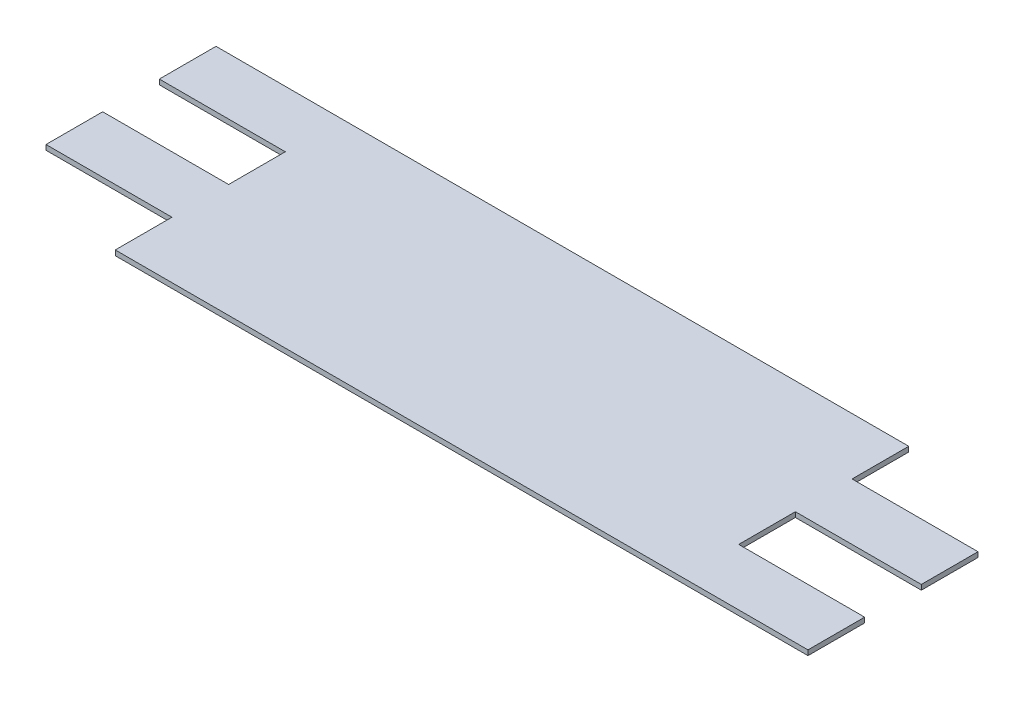
ISO-10303-21;
HEADER;
FILE_DESCRIPTION(('STEP AP214'),'2;1');
FILE_NAME('part.step','',(''),(''),'','','');
FILE_SCHEMA(('AUTOMOTIVE_DESIGN { 1 0 10303 214 1 1 1 1 }'));
ENDSEC;
DATA;
#1=APPLICATION_CONTEXT('core data for automotive mechanical design processes');
#2=APPLICATION_PROTOCOL_DEFINITION('international standard','automotive_design',2000,#1);
#3=PRODUCT_CONTEXT('',#1,'mechanical');
#4=PRODUCT('Part','Part','',(#3));
#5=PRODUCT_RELATED_PRODUCT_CATEGORY('part','',(#4));
#6=PRODUCT_DEFINITION_FORMATION('','',#4);
#7=PRODUCT_DEFINITION_CONTEXT('part definition',#1,'design');
#8=PRODUCT_DEFINITION('design','',#6,#7);
#9=PRODUCT_DEFINITION_SHAPE('','',#8);
#10=(LENGTH_UNIT() NAMED_UNIT(*) SI_UNIT(.MILLI.,.METRE.));
#11=(NAMED_UNIT(*) PLANE_ANGLE_UNIT() SI_UNIT($,.RADIAN.));
#12=(NAMED_UNIT(*) SI_UNIT($,.STERADIAN.) SOLID_ANGLE_UNIT());
#13=UNCERTAINTY_MEASURE_WITH_UNIT(LENGTH_MEASURE(1.E-05),#10,'distance_accuracy_value','');
#14=(GEOMETRIC_REPRESENTATION_CONTEXT(3) GLOBAL_UNCERTAINTY_ASSIGNED_CONTEXT((#13)) GLOBAL_UNIT_ASSIGNED_CONTEXT((#10,
#11,#12)) REPRESENTATION_CONTEXT('',''));
#15=CARTESIAN_POINT('',(0.,0.,0.));
#16=DIRECTION('',(0.,0.,1.));
#17=DIRECTION('',(1.,0.,0.));
#18=AXIS2_PLACEMENT_3D('',#15,#16,#17);
#19=CARTESIAN_POINT('',(0.,0.4,0.));
#20=DIRECTION('',(1.,0.,0.));
#21=DIRECTION('',(0.,0.,-1.));
#22=AXIS2_PLACEMENT_3D('',#19,#20,#21);
#23=PLANE('',#22);
#24=DIRECTION('',(0.,0.,1.));
#25=VECTOR('',#24,1.);
#26=CARTESIAN_POINT('',(0.,0.,0.));
#27=LINE('',#26,#25);
#28=CARTESIAN_POINT('',(0.,0.,0.));
#29=VERTEX_POINT('',#28);
#30=CARTESIAN_POINT('',(0.,0.,4.5));
#31=VERTEX_POINT('',#30);
#32=EDGE_CURVE('E183',#29,#31,#27,.T.);
#33=ORIENTED_EDGE('',*,*,#32,.T.);
#34=DIRECTION('',(0.,-1.,0.));
#35=VECTOR('',#34,1.);
#36=CARTESIAN_POINT('',(0.,0.4,4.5));
#37=LINE('',#36,#35);
#38=CARTESIAN_POINT('',(0.,0.4,4.5));
#39=VERTEX_POINT('',#38);
#40=EDGE_CURVE('E11',#39,#31,#37,.T.);
#41=ORIENTED_EDGE('',*,*,#40,.F.);
#42=DIRECTION('',(0.,0.,1.));
#43=VECTOR('',#42,1.);
#44=CARTESIAN_POINT('',(0.,0.4,0.));
#45=LINE('',#44,#43);
#46=CARTESIAN_POINT('',(0.,0.4,0.));
#47=VERTEX_POINT('',#46);
#48=EDGE_CURVE('E213',#47,#39,#45,.T.);
#49=ORIENTED_EDGE('',*,*,#48,.F.);
#50=DIRECTION('',(0.,-1.,0.));
#51=VECTOR('',#50,1.);
#52=CARTESIAN_POINT('',(0.,0.4,0.));
#53=LINE('',#52,#51);
#54=EDGE_CURVE('E179',#47,#29,#53,.T.);
#55=ORIENTED_EDGE('',*,*,#54,.T.);
#56=EDGE_LOOP('',(#33,#41,#49,#55));
#57=FACE_BOUND('',#56,.T.);
#58=ADVANCED_FACE('F39',(#57),#23,.F.);
#59=CARTESIAN_POINT('',(0.,0.4,4.5));
#60=DIRECTION('',(0.,0.,-1.));
#61=DIRECTION('',(-1.,0.,0.));
#62=AXIS2_PLACEMENT_3D('',#59,#60,#61);
#63=PLANE('',#62);
#64=DIRECTION('',(1.,0.,0.));
#65=VECTOR('',#64,1.);
#66=CARTESIAN_POINT('',(0.,0.,4.5));
#67=LINE('',#66,#65);
#68=CARTESIAN_POINT('',(10.,0.,4.5));
#69=VERTEX_POINT('',#68);
#70=EDGE_CURVE('E186',#31,#69,#67,.T.);
#71=ORIENTED_EDGE('',*,*,#70,.T.);
#72=DIRECTION('',(0.,-1.,0.));
#73=VECTOR('',#72,1.);
#74=CARTESIAN_POINT('',(10.,0.4,4.5));
#75=LINE('',#74,#73);
#76=CARTESIAN_POINT('',(10.,0.4,4.5));
#77=VERTEX_POINT('',#76);
#78=EDGE_CURVE('E47',#77,#69,#75,.T.);
#79=ORIENTED_EDGE('',*,*,#78,.F.);
#80=DIRECTION('',(1.,0.,0.));
#81=VECTOR('',#80,1.);
#82=CARTESIAN_POINT('',(0.,0.4,4.5));
#83=LINE('',#82,#81);
#84=EDGE_CURVE('E122',#39,#77,#83,.T.);
#85=ORIENTED_EDGE('',*,*,#84,.F.);
#86=ORIENTED_EDGE('',*,*,#40,.T.);
#87=EDGE_LOOP('',(#71,#79,#85,#86));
#88=FACE_BOUND('',#87,.T.);
#89=ADVANCED_FACE('F311',(#88),#63,.F.);
#90=CARTESIAN_POINT('',(10.,0.4,4.5));
#91=DIRECTION('',(1.,0.,0.));
#92=DIRECTION('',(0.,0.,-1.));
#93=AXIS2_PLACEMENT_3D('',#90,#91,#92);
#94=PLANE('',#93);
#95=DIRECTION('',(0.,0.,1.));
#96=VECTOR('',#95,1.);
#97=CARTESIAN_POINT('',(10.,0.,4.5));
#98=LINE('',#97,#96);
#99=CARTESIAN_POINT('',(10.,0.,9.));
#100=VERTEX_POINT('',#99);
#101=EDGE_CURVE('E188',#69,#100,#98,.T.);
#102=ORIENTED_EDGE('',*,*,#101,.T.);
#103=DIRECTION('',(0.,-1.,0.));
#104=VECTOR('',#103,1.);
#105=CARTESIAN_POINT('',(10.,0.4,9.));
#106=LINE('',#105,#104);
#107=CARTESIAN_POINT('',(10.,0.4,9.));
#108=VERTEX_POINT('',#107);
#109=EDGE_CURVE('E244',#108,#100,#106,.T.);
#110=ORIENTED_EDGE('',*,*,#109,.F.);
#111=DIRECTION('',(0.,0.,1.));
#112=VECTOR('',#111,1.);
#113=CARTESIAN_POINT('',(10.,0.4,4.5));
#114=LINE('',#113,#112);
#115=EDGE_CURVE('E252',#77,#108,#114,.T.);
#116=ORIENTED_EDGE('',*,*,#115,.F.);
#117=ORIENTED_EDGE('',*,*,#78,.T.);
#118=EDGE_LOOP('',(#102,#110,#116,#117));
#119=FACE_BOUND('',#118,.T.);
#120=ADVANCED_FACE('F250',(#119),#94,.F.);
#121=CARTESIAN_POINT('',(10.,0.4,9.));
#122=DIRECTION('',(0.,0.,1.));
#123=DIRECTION('',(1.,0.,0.));
#124=AXIS2_PLACEMENT_3D('',#121,#122,#123);
#125=PLANE('',#124);
#126=DIRECTION('',(-1.,0.,0.));
#127=VECTOR('',#126,1.);
#128=CARTESIAN_POINT('',(10.,0.,9.));
#129=LINE('',#128,#127);
#130=CARTESIAN_POINT('',(0.,0.,8.99999999999988));
#131=VERTEX_POINT('',#130);
#132=EDGE_CURVE('E190',#100,#131,#129,.T.);
#133=ORIENTED_EDGE('',*,*,#132,.T.);
#134=DIRECTION('',(0.,-1.,0.));
#135=VECTOR('',#134,1.);
#136=CARTESIAN_POINT('',(0.,0.4,8.99999999999988));
#137=LINE('',#136,#135);
#138=CARTESIAN_POINT('',(0.,0.4,8.99999999999988));
#139=VERTEX_POINT('',#138);
#140=EDGE_CURVE('E241',#139,#131,#137,.T.);
#141=ORIENTED_EDGE('',*,*,#140,.F.);
#142=DIRECTION('',(-1.,0.,0.));
#143=VECTOR('',#142,1.);
#144=CARTESIAN_POINT('',(10.,0.4,9.));
#145=LINE('',#144,#143);
#146=EDGE_CURVE('E270',#108,#139,#145,.T.);
#147=ORIENTED_EDGE('',*,*,#146,.F.);
#148=ORIENTED_EDGE('',*,*,#109,.T.);
#149=EDGE_LOOP('',(#133,#141,#147,#148));
#150=FACE_BOUND('',#149,.T.);
#151=ADVANCED_FACE('F261',(#150),#125,.F.);
#152=CARTESIAN_POINT('',(0.,0.4,8.99999999999988));
#153=DIRECTION('',(1.,0.,0.));
#154=DIRECTION('',(0.,0.,-1.));
#155=AXIS2_PLACEMENT_3D('',#152,#153,#154);
#156=PLANE('',#155);
#157=DIRECTION('',(0.,0.,1.));
#158=VECTOR('',#157,1.);
#159=CARTESIAN_POINT('',(0.,0.,8.99999999999988));
#160=LINE('',#159,#158);
#161=CARTESIAN_POINT('',(0.,0.,13.5000000000007));
#162=VERTEX_POINT('',#161);
#163=EDGE_CURVE('E192',#131,#162,#160,.T.);
#164=ORIENTED_EDGE('',*,*,#163,.T.);
#165=DIRECTION('',(0.,-1.,0.));
#166=VECTOR('',#165,1.);
#167=CARTESIAN_POINT('',(0.,0.4,13.5000000000007));
#168=LINE('',#167,#166);
#169=CARTESIAN_POINT('',(0.,0.4,13.5000000000007));
#170=VERTEX_POINT('',#169);
#171=EDGE_CURVE('E238',#170,#162,#168,.T.);
#172=ORIENTED_EDGE('',*,*,#171,.F.);
#173=DIRECTION('',(0.,0.,1.));
#174=VECTOR('',#173,1.);
#175=CARTESIAN_POINT('',(0.,0.4,8.99999999999988));
#176=LINE('',#175,#174);
#177=EDGE_CURVE('E267',#139,#170,#176,.T.);
#178=ORIENTED_EDGE('',*,*,#177,.F.);
#179=ORIENTED_EDGE('',*,*,#140,.T.);
#180=EDGE_LOOP('',(#164,#172,#178,#179));
#181=FACE_BOUND('',#180,.T.);
#182=ADVANCED_FACE('F265',(#181),#156,.F.);
#183=CARTESIAN_POINT('',(0.,0.4,13.5000000000007));
#184=DIRECTION('',(0.,0.,-1.));
#185=DIRECTION('',(-1.,0.,0.));
#186=AXIS2_PLACEMENT_3D('',#183,#184,#185);
#187=PLANE('',#186);
#188=DIRECTION('',(1.,0.,0.));
#189=VECTOR('',#188,1.);
#190=CARTESIAN_POINT('',(0.,0.,13.5000000000007));
#191=LINE('',#190,#189);
#192=CARTESIAN_POINT('',(10.,0.,13.5));
#193=VERTEX_POINT('',#192);
#194=EDGE_CURVE('E194',#162,#193,#191,.T.);
#195=ORIENTED_EDGE('',*,*,#194,.T.);
#196=DIRECTION('',(0.,-1.,0.));
#197=VECTOR('',#196,1.);
#198=CARTESIAN_POINT('',(10.,0.4,13.5));
#199=LINE('',#198,#197);
#200=CARTESIAN_POINT('',(10.,0.4,13.5));
#201=VERTEX_POINT('',#200);
#202=EDGE_CURVE('E235',#201,#193,#199,.T.);
#203=ORIENTED_EDGE('',*,*,#202,.F.);
#204=DIRECTION('',(1.,0.,0.));
#205=VECTOR('',#204,1.);
#206=CARTESIAN_POINT('',(0.,0.4,13.5000000000007));
#207=LINE('',#206,#205);
#208=EDGE_CURVE('E269',#170,#201,#207,.T.);
#209=ORIENTED_EDGE('',*,*,#208,.F.);
#210=ORIENTED_EDGE('',*,*,#171,.T.);
#211=EDGE_LOOP('',(#195,#203,#209,#210));
#212=FACE_BOUND('',#211,.T.);
#213=ADVANCED_FACE('F324',(#212),#187,.F.);
#214=CARTESIAN_POINT('',(10.,0.4,13.5));
#215=DIRECTION('',(1.,0.,0.));
#216=DIRECTION('',(0.,0.,-1.));
#217=AXIS2_PLACEMENT_3D('',#214,#215,#216);
#218=PLANE('',#217);
#219=DIRECTION('',(0.,0.,1.));
#220=VECTOR('',#219,1.);
#221=CARTESIAN_POINT('',(10.,0.,13.5));
#222=LINE('',#221,#220);
#223=CARTESIAN_POINT('',(10.,0.,18.));
#224=VERTEX_POINT('',#223);
#225=EDGE_CURVE('E196',#193,#224,#222,.T.);
#226=ORIENTED_EDGE('',*,*,#225,.T.);
#227=DIRECTION('',(0.,-1.,0.));
#228=VECTOR('',#227,1.);
#229=CARTESIAN_POINT('',(10.,0.4,18.));
#230=LINE('',#229,#228);
#231=CARTESIAN_POINT('',(10.,0.4,18.));
#232=VERTEX_POINT('',#231);
#233=EDGE_CURVE('E232',#232,#224,#230,.T.);
#234=ORIENTED_EDGE('',*,*,#233,.F.);
#235=DIRECTION('',(0.,0.,1.));
#236=VECTOR('',#235,1.);
#237=CARTESIAN_POINT('',(10.,0.4,13.5));
#238=LINE('',#237,#236);
#239=EDGE_CURVE('E272',#201,#232,#238,.T.);
#240=ORIENTED_EDGE('',*,*,#239,.F.);
#241=ORIENTED_EDGE('',*,*,#202,.T.);
#242=EDGE_LOOP('',(#226,#234,#240,#241));
#243=FACE_BOUND('',#242,.T.);
#244=ADVANCED_FACE('F327',(#243),#218,.F.);
#245=CARTESIAN_POINT('',(65.,0.4,18.));
#246=DIRECTION('',(0.,0.,-1.));
#247=DIRECTION('',(-1.,0.,0.));
#248=AXIS2_PLACEMENT_3D('',#245,#246,#247);
#249=PLANE('',#248);
#250=DIRECTION('',(1.,0.,0.));
#251=VECTOR('',#250,1.);
#252=CARTESIAN_POINT('',(65.,0.,18.));
#253=LINE('',#252,#251);
#254=CARTESIAN_POINT('',(65.,0.,18.));
#255=VERTEX_POINT('',#254);
#256=EDGE_CURVE('E198',#224,#255,#253,.T.);
#257=ORIENTED_EDGE('',*,*,#256,.T.);
#258=DIRECTION('',(0.,-1.,0.));
#259=VECTOR('',#258,1.);
#260=CARTESIAN_POINT('',(65.,0.4,18.));
#261=LINE('',#260,#259);
#262=CARTESIAN_POINT('',(65.,0.4,18.));
#263=VERTEX_POINT('',#262);
#264=EDGE_CURVE('E229',#263,#255,#261,.T.);
#265=ORIENTED_EDGE('',*,*,#264,.F.);
#266=DIRECTION('',(1.,0.,0.));
#267=VECTOR('',#266,1.);
#268=CARTESIAN_POINT('',(65.,0.4,18.));
#269=LINE('',#268,#267);
#270=EDGE_CURVE('E278',#232,#263,#269,.T.);
#271=ORIENTED_EDGE('',*,*,#270,.F.);
#272=ORIENTED_EDGE('',*,*,#233,.T.);
#273=EDGE_LOOP('',(#257,#265,#271,#272));
#274=FACE_BOUND('',#273,.T.);
#275=ADVANCED_FACE('F331',(#274),#249,.F.);
#276=CARTESIAN_POINT('',(65.,0.4,13.5));
#277=DIRECTION('',(-1.,0.,0.));
#278=DIRECTION('',(0.,0.,1.));
#279=AXIS2_PLACEMENT_3D('',#276,#277,#278);
#280=PLANE('',#279);
#281=DIRECTION('',(0.,0.,-1.));
#282=VECTOR('',#281,1.);
#283=CARTESIAN_POINT('',(65.,0.,13.5));
#284=LINE('',#283,#282);
#285=CARTESIAN_POINT('',(65.,0.,13.5));
#286=VERTEX_POINT('',#285);
#287=EDGE_CURVE('E200',#255,#286,#284,.T.);
#288=ORIENTED_EDGE('',*,*,#287,.T.);
#289=DIRECTION('',(0.,-1.,0.));
#290=VECTOR('',#289,1.);
#291=CARTESIAN_POINT('',(65.,0.4,13.5));
#292=LINE('',#291,#290);
#293=CARTESIAN_POINT('',(65.,0.4,13.5));
#294=VERTEX_POINT('',#293);
#295=EDGE_CURVE('E226',#294,#286,#292,.T.);
#296=ORIENTED_EDGE('',*,*,#295,.F.);
#297=DIRECTION('',(0.,0.,-1.));
#298=VECTOR('',#297,1.);
#299=CARTESIAN_POINT('',(65.,0.4,13.5));
#300=LINE('',#299,#298);
#301=EDGE_CURVE('E280',#263,#294,#300,.T.);
#302=ORIENTED_EDGE('',*,*,#301,.F.);
#303=ORIENTED_EDGE('',*,*,#264,.T.);
#304=EDGE_LOOP('',(#288,#296,#302,#303));
#305=FACE_BOUND('',#304,.T.);
#306=ADVANCED_FACE('F335',(#305),#280,.F.);
#307=CARTESIAN_POINT('',(55.0000000000001,0.4,13.5000000000007));
#308=DIRECTION('',(0.,0.,1.));
#309=DIRECTION('',(1.,0.,0.));
#310=AXIS2_PLACEMENT_3D('',#307,#308,#309);
#311=PLANE('',#310);
#312=DIRECTION('',(-1.,0.,0.));
#313=VECTOR('',#312,1.);
#314=CARTESIAN_POINT('',(55.0000000000001,0.,13.5000000000007));
#315=LINE('',#314,#313);
#316=CARTESIAN_POINT('',(55.0000000000001,0.,13.5000000000007));
#317=VERTEX_POINT('',#316);
#318=EDGE_CURVE('E202',#286,#317,#315,.T.);
#319=ORIENTED_EDGE('',*,*,#318,.T.);
#320=DIRECTION('',(0.,-1.,0.));
#321=VECTOR('',#320,1.);
#322=CARTESIAN_POINT('',(55.0000000000001,0.4,13.5000000000007));
#323=LINE('',#322,#321);
#324=CARTESIAN_POINT('',(55.0000000000001,0.4,13.5000000000007));
#325=VERTEX_POINT('',#324);
#326=EDGE_CURVE('E223',#325,#317,#323,.T.);
#327=ORIENTED_EDGE('',*,*,#326,.F.);
#328=DIRECTION('',(-1.,0.,0.));
#329=VECTOR('',#328,1.);
#330=CARTESIAN_POINT('',(55.0000000000001,0.4,13.5000000000007));
#331=LINE('',#330,#329);
#332=EDGE_CURVE('E282',#294,#325,#331,.T.);
#333=ORIENTED_EDGE('',*,*,#332,.F.);
#334=ORIENTED_EDGE('',*,*,#295,.T.);
#335=EDGE_LOOP('',(#319,#327,#333,#334));
#336=FACE_BOUND('',#335,.T.);
#337=ADVANCED_FACE('F339',(#336),#311,.F.);
#338=CARTESIAN_POINT('',(55.,0.4,8.99999999999988));
#339=DIRECTION('',(-1.,0.,0.));
#340=DIRECTION('',(0.,0.,1.));
#341=AXIS2_PLACEMENT_3D('',#338,#339,#340);
#342=PLANE('',#341);
#343=DIRECTION('',(0.,0.,-1.));
#344=VECTOR('',#343,1.);
#345=CARTESIAN_POINT('',(55.,0.,8.99999999999988));
#346=LINE('',#345,#344);
#347=CARTESIAN_POINT('',(55.,0.,8.99999999999988));
#348=VERTEX_POINT('',#347);
#349=EDGE_CURVE('E204',#317,#348,#346,.T.);
#350=ORIENTED_EDGE('',*,*,#349,.T.);
#351=DIRECTION('',(0.,-1.,0.));
#352=VECTOR('',#351,1.);
#353=CARTESIAN_POINT('',(55.,0.4,8.99999999999988));
#354=LINE('',#353,#352);
#355=CARTESIAN_POINT('',(55.,0.4,8.99999999999988));
#356=VERTEX_POINT('',#355);
#357=EDGE_CURVE('E220',#356,#348,#354,.T.);
#358=ORIENTED_EDGE('',*,*,#357,.F.);
#359=DIRECTION('',(0.,0.,-1.));
#360=VECTOR('',#359,1.);
#361=CARTESIAN_POINT('',(55.,0.4,8.99999999999988));
#362=LINE('',#361,#360);
#363=EDGE_CURVE('E284',#325,#356,#362,.T.);
#364=ORIENTED_EDGE('',*,*,#363,.F.);
#365=ORIENTED_EDGE('',*,*,#326,.T.);
#366=EDGE_LOOP('',(#350,#358,#364,#365));
#367=FACE_BOUND('',#366,.T.);
#368=ADVANCED_FACE('F343',(#367),#342,.F.);
#369=CARTESIAN_POINT('',(65.,0.4,9.));
#370=DIRECTION('',(0.,0.,-1.));
#371=DIRECTION('',(-1.,0.,0.));
#372=AXIS2_PLACEMENT_3D('',#369,#370,#371);
#373=PLANE('',#372);
#374=DIRECTION('',(1.,0.,0.));
#375=VECTOR('',#374,1.);
#376=CARTESIAN_POINT('',(65.,0.,9.));
#377=LINE('',#376,#375);
#378=CARTESIAN_POINT('',(65.,0.,9.));
#379=VERTEX_POINT('',#378);
#380=EDGE_CURVE('E206',#348,#379,#377,.T.);
#381=ORIENTED_EDGE('',*,*,#380,.T.);
#382=DIRECTION('',(0.,-1.,0.));
#383=VECTOR('',#382,1.);
#384=CARTESIAN_POINT('',(65.,0.4,9.));
#385=LINE('',#384,#383);
#386=CARTESIAN_POINT('',(65.,0.4,9.));
#387=VERTEX_POINT('',#386);
#388=EDGE_CURVE('E217',#387,#379,#385,.T.);
#389=ORIENTED_EDGE('',*,*,#388,.F.);
#390=DIRECTION('',(1.,0.,0.));
#391=VECTOR('',#390,1.);
#392=CARTESIAN_POINT('',(65.,0.4,9.));
#393=LINE('',#392,#391);
#394=EDGE_CURVE('E286',#356,#387,#393,.T.);
#395=ORIENTED_EDGE('',*,*,#394,.F.);
#396=ORIENTED_EDGE('',*,*,#357,.T.);
#397=EDGE_LOOP('',(#381,#389,#395,#396));
#398=FACE_BOUND('',#397,.T.);
#399=ADVANCED_FACE('F292',(#398),#373,.F.);
#400=CARTESIAN_POINT('',(65.,0.4,4.5));
#401=DIRECTION('',(-1.,0.,0.));
#402=DIRECTION('',(0.,0.,1.));
#403=AXIS2_PLACEMENT_3D('',#400,#401,#402);
#404=PLANE('',#403);
#405=DIRECTION('',(0.,0.,-1.));
#406=VECTOR('',#405,1.);
#407=CARTESIAN_POINT('',(65.,0.,4.5));
#408=LINE('',#407,#406);
#409=CARTESIAN_POINT('',(65.,0.,4.5));
#410=VERTEX_POINT('',#409);
#411=EDGE_CURVE('E208',#379,#410,#408,.T.);
#412=ORIENTED_EDGE('',*,*,#411,.T.);
#413=DIRECTION('',(0.,-1.,0.));
#414=VECTOR('',#413,1.);
#415=CARTESIAN_POINT('',(65.,0.4,4.5));
#416=LINE('',#415,#414);
#417=CARTESIAN_POINT('',(65.,0.4,4.5));
#418=VERTEX_POINT('',#417);
#419=EDGE_CURVE('E174',#418,#410,#416,.T.);
#420=ORIENTED_EDGE('',*,*,#419,.F.);
#421=DIRECTION('',(0.,0.,-1.));
#422=VECTOR('',#421,1.);
#423=CARTESIAN_POINT('',(65.,0.4,4.5));
#424=LINE('',#423,#422);
#425=EDGE_CURVE('E165',#387,#418,#424,.T.);
#426=ORIENTED_EDGE('',*,*,#425,.F.);
#427=ORIENTED_EDGE('',*,*,#388,.T.);
#428=EDGE_LOOP('',(#412,#420,#426,#427));
#429=FACE_BOUND('',#428,.T.);
#430=ADVANCED_FACE('F296',(#429),#404,.F.);
#431=CARTESIAN_POINT('',(55.,0.4,4.5));
#432=DIRECTION('',(0.,0.,1.));
#433=DIRECTION('',(1.,0.,0.));
#434=AXIS2_PLACEMENT_3D('',#431,#432,#433);
#435=PLANE('',#434);
#436=DIRECTION('',(-1.,0.,0.));
#437=VECTOR('',#436,1.);
#438=CARTESIAN_POINT('',(55.,0.,4.5));
#439=LINE('',#438,#437);
#440=CARTESIAN_POINT('',(55.,0.,4.5));
#441=VERTEX_POINT('',#440);
#442=EDGE_CURVE('E173',#410,#441,#439,.T.);
#443=ORIENTED_EDGE('',*,*,#442,.T.);
#444=DIRECTION('',(0.,-1.,0.));
#445=VECTOR('',#444,1.);
#446=CARTESIAN_POINT('',(55.,0.4,4.5));
#447=LINE('',#446,#445);
#448=CARTESIAN_POINT('',(55.,0.4,4.5));
#449=VERTEX_POINT('',#448);
#450=EDGE_CURVE('E170',#449,#441,#447,.T.);
#451=ORIENTED_EDGE('',*,*,#450,.F.);
#452=DIRECTION('',(-1.,0.,0.));
#453=VECTOR('',#452,1.);
#454=CARTESIAN_POINT('',(55.,0.4,4.5));
#455=LINE('',#454,#453);
#456=EDGE_CURVE('E159',#418,#449,#455,.T.);
#457=ORIENTED_EDGE('',*,*,#456,.F.);
#458=ORIENTED_EDGE('',*,*,#419,.T.);
#459=EDGE_LOOP('',(#443,#451,#457,#458));
#460=FACE_BOUND('',#459,.T.);
#461=ADVANCED_FACE('F171',(#460),#435,.F.);
#462=CARTESIAN_POINT('',(55.,0.4,0.));
#463=DIRECTION('',(-1.,0.,0.));
#464=DIRECTION('',(0.,0.,1.));
#465=AXIS2_PLACEMENT_3D('',#462,#463,#464);
#466=PLANE('',#465);
#467=DIRECTION('',(0.,0.,-1.));
#468=VECTOR('',#467,1.);
#469=CARTESIAN_POINT('',(55.,0.,0.));
#470=LINE('',#469,#468);
#471=CARTESIAN_POINT('',(55.,0.,0.));
#472=VERTEX_POINT('',#471);
#473=EDGE_CURVE('E108',#441,#472,#470,.T.);
#474=ORIENTED_EDGE('',*,*,#473,.T.);
#475=DIRECTION('',(0.,-1.,0.));
#476=VECTOR('',#475,1.);
#477=CARTESIAN_POINT('',(55.,0.4,0.));
#478=LINE('',#477,#476);
#479=CARTESIAN_POINT('',(55.,0.4,0.));
#480=VERTEX_POINT('',#479);
#481=EDGE_CURVE('E175',#480,#472,#478,.T.);
#482=ORIENTED_EDGE('',*,*,#481,.F.);
#483=DIRECTION('',(0.,0.,-1.));
#484=VECTOR('',#483,1.);
#485=CARTESIAN_POINT('',(55.,0.4,0.));
#486=LINE('',#485,#484);
#487=EDGE_CURVE('E163',#449,#480,#486,.T.);
#488=ORIENTED_EDGE('',*,*,#487,.F.);
#489=ORIENTED_EDGE('',*,*,#450,.T.);
#490=EDGE_LOOP('',(#474,#482,#488,#489));
#491=FACE_BOUND('',#490,.T.);
#492=ADVANCED_FACE('F177',(#491),#466,.F.);
#493=CARTESIAN_POINT('',(0.,0.4,0.));
#494=DIRECTION('',(0.,0.,1.));
#495=DIRECTION('',(1.,0.,0.));
#496=AXIS2_PLACEMENT_3D('',#493,#494,#495);
#497=PLANE('',#496);
#498=DIRECTION('',(-1.,0.,0.));
#499=VECTOR('',#498,1.);
#500=CARTESIAN_POINT('',(0.,0.,0.));
#501=LINE('',#500,#499);
#502=EDGE_CURVE('E114',#472,#29,#501,.T.);
#503=ORIENTED_EDGE('',*,*,#502,.T.);
#504=ORIENTED_EDGE('',*,*,#54,.F.);
#505=DIRECTION('',(-1.,0.,0.));
#506=VECTOR('',#505,1.);
#507=CARTESIAN_POINT('',(0.,0.4,0.));
#508=LINE('',#507,#506);
#509=EDGE_CURVE('E55',#480,#47,#508,.T.);
#510=ORIENTED_EDGE('',*,*,#509,.F.);
#511=ORIENTED_EDGE('',*,*,#481,.T.);
#512=EDGE_LOOP('',(#503,#504,#510,#511));
#513=FACE_BOUND('',#512,.T.);
#514=ADVANCED_FACE('F300',(#513),#497,.F.);
#515=CARTESIAN_POINT('',(0.,0.4,0.));
#516=DIRECTION('',(0.,1.,0.));
#517=DIRECTION('',(0.,0.,1.));
#518=AXIS2_PLACEMENT_3D('',#515,#516,#517);
#519=PLANE('',#518);
#520=ORIENTED_EDGE('',*,*,#48,.T.);
#521=ORIENTED_EDGE('',*,*,#84,.T.);
#522=ORIENTED_EDGE('',*,*,#115,.T.);
#523=ORIENTED_EDGE('',*,*,#146,.T.);
#524=ORIENTED_EDGE('',*,*,#177,.T.);
#525=ORIENTED_EDGE('',*,*,#208,.T.);
#526=ORIENTED_EDGE('',*,*,#239,.T.);
#527=ORIENTED_EDGE('',*,*,#270,.T.);
#528=ORIENTED_EDGE('',*,*,#301,.T.);
#529=ORIENTED_EDGE('',*,*,#332,.T.);
#530=ORIENTED_EDGE('',*,*,#363,.T.);
#531=ORIENTED_EDGE('',*,*,#394,.T.);
#532=ORIENTED_EDGE('',*,*,#425,.T.);
#533=ORIENTED_EDGE('',*,*,#456,.T.);
#534=ORIENTED_EDGE('',*,*,#487,.T.);
#535=ORIENTED_EDGE('',*,*,#509,.T.);
#536=EDGE_LOOP('',(#520,#521,#522,#523,#524,#525,#526,#527,#528,#529,#530,#531,#532,#533,#534,#535));
#537=FACE_BOUND('',#536,.T.);
#538=ADVANCED_FACE('F161',(#537),#519,.T.);
#539=CARTESIAN_POINT('',(0.,0.,0.));
#540=DIRECTION('',(0.,1.,0.));
#541=DIRECTION('',(0.,0.,1.));
#542=AXIS2_PLACEMENT_3D('',#539,#540,#541);
#543=PLANE('',#542);
#544=ORIENTED_EDGE('',*,*,#32,.F.);
#545=ORIENTED_EDGE('',*,*,#502,.F.);
#546=ORIENTED_EDGE('',*,*,#473,.F.);
#547=ORIENTED_EDGE('',*,*,#442,.F.);
#548=ORIENTED_EDGE('',*,*,#411,.F.);
#549=ORIENTED_EDGE('',*,*,#380,.F.);
#550=ORIENTED_EDGE('',*,*,#349,.F.);
#551=ORIENTED_EDGE('',*,*,#318,.F.);
#552=ORIENTED_EDGE('',*,*,#287,.F.);
#553=ORIENTED_EDGE('',*,*,#256,.F.);
#554=ORIENTED_EDGE('',*,*,#225,.F.);
#555=ORIENTED_EDGE('',*,*,#194,.F.);
#556=ORIENTED_EDGE('',*,*,#163,.F.);
#557=ORIENTED_EDGE('',*,*,#132,.F.);
#558=ORIENTED_EDGE('',*,*,#101,.F.);
#559=ORIENTED_EDGE('',*,*,#70,.F.);
#560=EDGE_LOOP('',(#544,#545,#546,#547,#548,#549,#550,#551,#552,#553,#554,#555,#556,#557,#558,#559));
#561=FACE_BOUND('',#560,.T.);
#562=ADVANCED_FACE('F256',(#561),#543,.F.);
#563=CLOSED_SHELL('',(#58,#89,#120,#151,#182,#213,#244,#275,#306,#337,#368,#399,#430,#461,#492,
#514,#538,#562));
#564=MANIFOLD_SOLID_BREP('B2',#563);
#565=ADVANCED_BREP_SHAPE_REPRESENTATION('',(#18,#564),#14);
#566=SHAPE_DEFINITION_REPRESENTATION(#9,#565);
ENDSEC;
END-ISO-10303-21;
